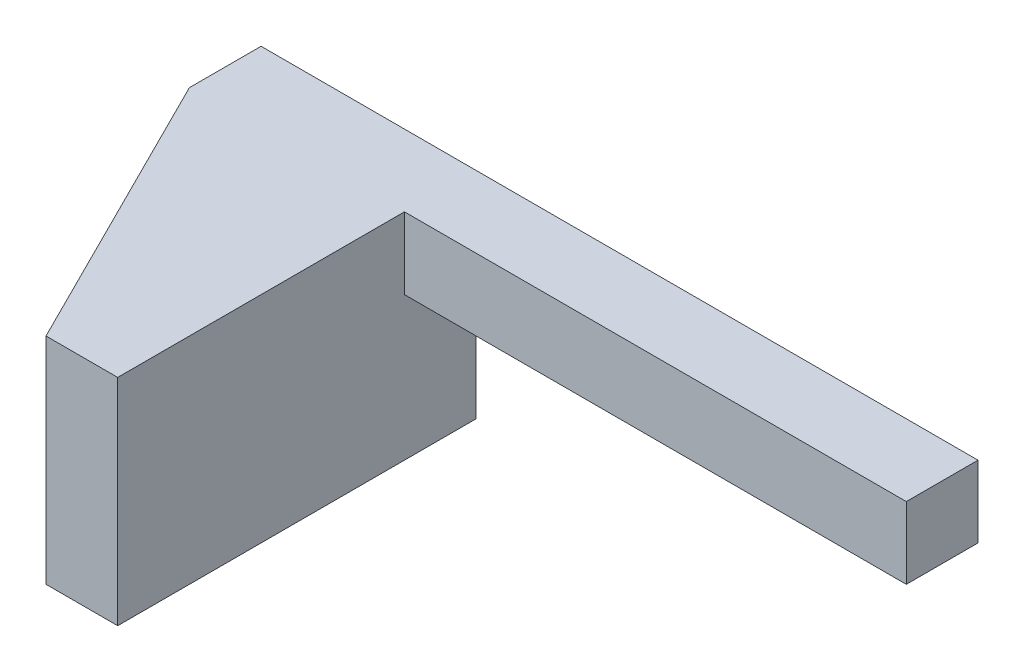
ISO-10303-21;
HEADER;
FILE_DESCRIPTION(('STEP AP214'),'2;1');
FILE_NAME('part.step','',(''),(''),'','','');
FILE_SCHEMA(('AUTOMOTIVE_DESIGN { 1 0 10303 214 1 1 1 1 }'));
ENDSEC;
DATA;
#1=APPLICATION_CONTEXT('core data for automotive mechanical design processes');
#2=APPLICATION_PROTOCOL_DEFINITION('international standard','automotive_design',2000,#1);
#3=PRODUCT_CONTEXT('',#1,'mechanical');
#4=PRODUCT('Part','Part','',(#3));
#5=PRODUCT_RELATED_PRODUCT_CATEGORY('part','',(#4));
#6=PRODUCT_DEFINITION_FORMATION('','',#4);
#7=PRODUCT_DEFINITION_CONTEXT('part definition',#1,'design');
#8=PRODUCT_DEFINITION('design','',#6,#7);
#9=PRODUCT_DEFINITION_SHAPE('','',#8);
#10=(LENGTH_UNIT() NAMED_UNIT(*) SI_UNIT(.MILLI.,.METRE.));
#11=(NAMED_UNIT(*) PLANE_ANGLE_UNIT() SI_UNIT($,.RADIAN.));
#12=(NAMED_UNIT(*) SI_UNIT($,.STERADIAN.) SOLID_ANGLE_UNIT());
#13=UNCERTAINTY_MEASURE_WITH_UNIT(LENGTH_MEASURE(1.E-05),#10,'distance_accuracy_value','');
#14=(GEOMETRIC_REPRESENTATION_CONTEXT(3) GLOBAL_UNCERTAINTY_ASSIGNED_CONTEXT((#13)) GLOBAL_UNIT_ASSIGNED_CONTEXT((#10,
#11,#12)) REPRESENTATION_CONTEXT('',''));
#15=CARTESIAN_POINT('',(0.,0.,0.));
#16=DIRECTION('',(0.,0.,1.));
#17=DIRECTION('',(1.,0.,0.));
#18=AXIS2_PLACEMENT_3D('',#15,#16,#17);
#19=CARTESIAN_POINT('',(0.,15.,5.));
#20=DIRECTION('',(-1.,0.,0.));
#21=DIRECTION('',(0.,0.,1.));
#22=AXIS2_PLACEMENT_3D('',#19,#20,#21);
#23=PLANE('',#22);
#24=DIRECTION('',(0.,-1.,0.));
#25=VECTOR('',#24,1.);
#26=CARTESIAN_POINT('',(0.,15.,5.));
#27=LINE('',#26,#25);
#28=CARTESIAN_POINT('',(0.,15.,5.));
#29=VERTEX_POINT('',#28);
#30=CARTESIAN_POINT('',(0.,10.,5.));
#31=VERTEX_POINT('',#30);
#32=EDGE_CURVE('E121',#29,#31,#27,.T.);
#33=ORIENTED_EDGE('',*,*,#32,.T.);
#34=DIRECTION('',(0.,0.,1.));
#35=VECTOR('',#34,1.);
#36=CARTESIAN_POINT('',(0.,10.,0.));
#37=LINE('',#36,#35);
#38=CARTESIAN_POINT('',(0.,10.,0.));
#39=VERTEX_POINT('',#38);
#40=EDGE_CURVE('E156',#39,#31,#37,.T.);
#41=ORIENTED_EDGE('',*,*,#40,.F.);
#42=DIRECTION('',(0.,-1.,0.));
#43=VECTOR('',#42,1.);
#44=CARTESIAN_POINT('',(0.,15.,0.));
#45=LINE('',#44,#43);
#46=CARTESIAN_POINT('',(0.,15.,0.));
#47=VERTEX_POINT('',#46);
#48=EDGE_CURVE('E47',#47,#39,#45,.T.);
#49=ORIENTED_EDGE('',*,*,#48,.F.);
#50=DIRECTION('',(0.,0.,-1.));
#51=VECTOR('',#50,1.);
#52=CARTESIAN_POINT('',(0.,15.,5.));
#53=LINE('',#52,#51);
#54=EDGE_CURVE('E134',#29,#47,#53,.T.);
#55=ORIENTED_EDGE('',*,*,#54,.F.);
#56=EDGE_LOOP('',(#33,#41,#49,#55));
#57=FACE_BOUND('',#56,.T.);
#58=ADVANCED_FACE('F39',(#57),#23,.F.);
#59=CARTESIAN_POINT('',(0.,15.,0.));
#60=DIRECTION('',(0.,0.,1.));
#61=DIRECTION('',(1.,0.,0.));
#62=AXIS2_PLACEMENT_3D('',#59,#60,#61);
#63=PLANE('',#62);
#64=DIRECTION('',(-1.,0.,0.));
#65=VECTOR('',#64,1.);
#66=CARTESIAN_POINT('',(0.,10.,0.));
#67=LINE('',#66,#65);
#68=CARTESIAN_POINT('',(-35.,9.99999999999999,0.));
#69=VERTEX_POINT('',#68);
#70=EDGE_CURVE('E150',#39,#69,#67,.T.);
#71=ORIENTED_EDGE('',*,*,#70,.T.);
#72=DIRECTION('',(0.,-1.,0.));
#73=VECTOR('',#72,1.);
#74=CARTESIAN_POINT('',(-35.,0.,0.));
#75=LINE('',#74,#73);
#76=CARTESIAN_POINT('',(-35.,0.,0.));
#77=VERTEX_POINT('',#76);
#78=EDGE_CURVE('E159',#69,#77,#75,.T.);
#79=ORIENTED_EDGE('',*,*,#78,.T.);
#80=DIRECTION('',(-1.,0.,0.));
#81=VECTOR('',#80,1.);
#82=CARTESIAN_POINT('',(0.,0.,0.));
#83=LINE('',#82,#81);
#84=CARTESIAN_POINT('',(-50.,0.,0.));
#85=VERTEX_POINT('',#84);
#86=EDGE_CURVE('E125',#77,#85,#83,.T.);
#87=ORIENTED_EDGE('',*,*,#86,.T.);
#88=DIRECTION('',(0.,-1.,0.));
#89=VECTOR('',#88,1.);
#90=CARTESIAN_POINT('',(-50.,15.,0.));
#91=LINE('',#90,#89);
#92=CARTESIAN_POINT('',(-50.,15.,0.));
#93=VERTEX_POINT('',#92);
#94=EDGE_CURVE('E141',#93,#85,#91,.T.);
#95=ORIENTED_EDGE('',*,*,#94,.F.);
#96=DIRECTION('',(-1.,0.,0.));
#97=VECTOR('',#96,1.);
#98=CARTESIAN_POINT('',(0.,15.,0.));
#99=LINE('',#98,#97);
#100=EDGE_CURVE('E90',#47,#93,#99,.T.);
#101=ORIENTED_EDGE('',*,*,#100,.F.);
#102=ORIENTED_EDGE('',*,*,#48,.T.);
#103=EDGE_LOOP('',(#71,#79,#87,#95,#101,#102));
#104=FACE_BOUND('',#103,.T.);
#105=ADVANCED_FACE('F146',(#104),#63,.F.);
#106=CARTESIAN_POINT('',(-50.,15.,0.));
#107=DIRECTION('',(1.,0.,0.));
#108=DIRECTION('',(0.,0.,-1.));
#109=AXIS2_PLACEMENT_3D('',#106,#107,#108);
#110=PLANE('',#109);
#111=DIRECTION('',(0.,0.,1.));
#112=VECTOR('',#111,1.);
#113=CARTESIAN_POINT('',(-50.,0.,0.));
#114=LINE('',#113,#112);
#115=CARTESIAN_POINT('',(-50.,0.,5.00000000000001));
#116=VERTEX_POINT('',#115);
#117=EDGE_CURVE('E127',#85,#116,#114,.T.);
#118=ORIENTED_EDGE('',*,*,#117,.T.);
#119=DIRECTION('',(0.,-1.,0.));
#120=VECTOR('',#119,1.);
#121=CARTESIAN_POINT('',(-50.,15.,5.00000000000001));
#122=LINE('',#121,#120);
#123=CARTESIAN_POINT('',(-50.,15.,5.00000000000001));
#124=VERTEX_POINT('',#123);
#125=EDGE_CURVE('E139',#124,#116,#122,.T.);
#126=ORIENTED_EDGE('',*,*,#125,.F.);
#127=DIRECTION('',(0.,0.,1.));
#128=VECTOR('',#127,1.);
#129=CARTESIAN_POINT('',(-50.,15.,0.));
#130=LINE('',#129,#128);
#131=EDGE_CURVE('E166',#93,#124,#130,.T.);
#132=ORIENTED_EDGE('',*,*,#131,.F.);
#133=ORIENTED_EDGE('',*,*,#94,.T.);
#134=EDGE_LOOP('',(#118,#126,#132,#133));
#135=FACE_BOUND('',#134,.T.);
#136=ADVANCED_FACE('F170',(#135),#110,.F.);
#137=CARTESIAN_POINT('',(-50.,15.,5.00000000000001));
#138=DIRECTION('',(0.894427190999916,0.,-0.447213595499958));
#139=DIRECTION('',(-0.447213595499958,0.,-0.894427190999916));
#140=AXIS2_PLACEMENT_3D('',#137,#138,#139);
#141=PLANE('',#140);
#142=DIRECTION('',(0.447213595499958,0.,0.894427190999916));
#143=VECTOR('',#142,1.);
#144=CARTESIAN_POINT('',(-50.,0.,5.00000000000001));
#145=LINE('',#144,#143);
#146=CARTESIAN_POINT('',(-40.,0.,25.));
#147=VERTEX_POINT('',#146);
#148=EDGE_CURVE('E73',#116,#147,#145,.T.);
#149=ORIENTED_EDGE('',*,*,#148,.T.);
#150=DIRECTION('',(0.,-1.,0.));
#151=VECTOR('',#150,1.);
#152=CARTESIAN_POINT('',(-40.,15.,25.));
#153=LINE('',#152,#151);
#154=CARTESIAN_POINT('',(-40.,15.,25.));
#155=VERTEX_POINT('',#154);
#156=EDGE_CURVE('E114',#155,#147,#153,.T.);
#157=ORIENTED_EDGE('',*,*,#156,.F.);
#158=DIRECTION('',(0.447213595499958,0.,0.894427190999916));
#159=VECTOR('',#158,1.);
#160=CARTESIAN_POINT('',(-50.,15.,5.00000000000001));
#161=LINE('',#160,#159);
#162=EDGE_CURVE('E107',#124,#155,#161,.T.);
#163=ORIENTED_EDGE('',*,*,#162,.F.);
#164=ORIENTED_EDGE('',*,*,#125,.T.);
#165=EDGE_LOOP('',(#149,#157,#163,#164));
#166=FACE_BOUND('',#165,.T.);
#167=ADVANCED_FACE('F172',(#166),#141,.F.);
#168=CARTESIAN_POINT('',(-40.,15.,25.));
#169=DIRECTION('',(0.,0.,-1.));
#170=DIRECTION('',(-1.,0.,0.));
#171=AXIS2_PLACEMENT_3D('',#168,#169,#170);
#172=PLANE('',#171);
#173=DIRECTION('',(1.,0.,0.));
#174=VECTOR('',#173,1.);
#175=CARTESIAN_POINT('',(-40.,0.,25.));
#176=LINE('',#175,#174);
#177=CARTESIAN_POINT('',(-35.,0.,25.));
#178=VERTEX_POINT('',#177);
#179=EDGE_CURVE('E112',#147,#178,#176,.T.);
#180=ORIENTED_EDGE('',*,*,#179,.T.);
#181=DIRECTION('',(0.,-1.,0.));
#182=VECTOR('',#181,1.);
#183=CARTESIAN_POINT('',(-35.,15.,25.));
#184=LINE('',#183,#182);
#185=CARTESIAN_POINT('',(-35.,15.,25.));
#186=VERTEX_POINT('',#185);
#187=EDGE_CURVE('E81',#186,#178,#184,.T.);
#188=ORIENTED_EDGE('',*,*,#187,.F.);
#189=DIRECTION('',(1.,0.,0.));
#190=VECTOR('',#189,1.);
#191=CARTESIAN_POINT('',(-40.,15.,25.));
#192=LINE('',#191,#190);
#193=EDGE_CURVE('E102',#155,#186,#192,.T.);
#194=ORIENTED_EDGE('',*,*,#193,.F.);
#195=ORIENTED_EDGE('',*,*,#156,.T.);
#196=EDGE_LOOP('',(#180,#188,#194,#195));
#197=FACE_BOUND('',#196,.T.);
#198=ADVANCED_FACE('F110',(#197),#172,.F.);
#199=CARTESIAN_POINT('',(-35.,15.,25.));
#200=DIRECTION('',(-1.,0.,0.));
#201=DIRECTION('',(0.,0.,1.));
#202=AXIS2_PLACEMENT_3D('',#199,#200,#201);
#203=PLANE('',#202);
#204=ORIENTED_EDGE('',*,*,#187,.T.);
#205=DIRECTION('',(0.,0.,-1.));
#206=VECTOR('',#205,1.);
#207=CARTESIAN_POINT('',(-35.,0.,25.));
#208=LINE('',#207,#206);
#209=EDGE_CURVE('E132',#178,#77,#208,.T.);
#210=ORIENTED_EDGE('',*,*,#209,.T.);
#211=ORIENTED_EDGE('',*,*,#78,.F.);
#212=DIRECTION('',(0.,0.,1.));
#213=VECTOR('',#212,1.);
#214=CARTESIAN_POINT('',(-35.,9.99999999999999,0.));
#215=LINE('',#214,#213);
#216=CARTESIAN_POINT('',(-35.,9.99999999999999,5.));
#217=VERTEX_POINT('',#216);
#218=EDGE_CURVE('E128',#69,#217,#215,.T.);
#219=ORIENTED_EDGE('',*,*,#218,.T.);
#220=DIRECTION('',(0.,-1.,0.));
#221=VECTOR('',#220,1.);
#222=CARTESIAN_POINT('',(-35.,15.,5.));
#223=LINE('',#222,#221);
#224=CARTESIAN_POINT('',(-35.,15.,5.));
#225=VERTEX_POINT('',#224);
#226=EDGE_CURVE('E115',#225,#217,#223,.T.);
#227=ORIENTED_EDGE('',*,*,#226,.F.);
#228=DIRECTION('',(0.,0.,-1.));
#229=VECTOR('',#228,1.);
#230=CARTESIAN_POINT('',(-35.,15.,25.));
#231=LINE('',#230,#229);
#232=EDGE_CURVE('E104',#186,#225,#231,.T.);
#233=ORIENTED_EDGE('',*,*,#232,.F.);
#234=EDGE_LOOP('',(#204,#210,#211,#219,#227,#233));
#235=FACE_BOUND('',#234,.T.);
#236=ADVANCED_FACE('F117',(#235),#203,.F.);
#237=CARTESIAN_POINT('',(-35.,15.,5.));
#238=DIRECTION('',(0.,0.,-1.));
#239=DIRECTION('',(-1.,0.,0.));
#240=AXIS2_PLACEMENT_3D('',#237,#238,#239);
#241=PLANE('',#240);
#242=ORIENTED_EDGE('',*,*,#226,.T.);
#243=DIRECTION('',(1.,0.,0.));
#244=VECTOR('',#243,1.);
#245=CARTESIAN_POINT('',(-35.,9.99999999999999,5.));
#246=LINE('',#245,#244);
#247=EDGE_CURVE('E11',#217,#31,#246,.T.);
#248=ORIENTED_EDGE('',*,*,#247,.T.);
#249=ORIENTED_EDGE('',*,*,#32,.F.);
#250=DIRECTION('',(1.,0.,0.));
#251=VECTOR('',#250,1.);
#252=CARTESIAN_POINT('',(-35.,15.,5.));
#253=LINE('',#252,#251);
#254=EDGE_CURVE('E55',#225,#29,#253,.T.);
#255=ORIENTED_EDGE('',*,*,#254,.F.);
#256=EDGE_LOOP('',(#242,#248,#249,#255));
#257=FACE_BOUND('',#256,.T.);
#258=ADVANCED_FACE('F184',(#257),#241,.F.);
#259=CARTESIAN_POINT('',(0.,15.,0.));
#260=DIRECTION('',(0.,1.,0.));
#261=DIRECTION('',(0.,0.,1.));
#262=AXIS2_PLACEMENT_3D('',#259,#260,#261);
#263=PLANE('',#262);
#264=ORIENTED_EDGE('',*,*,#54,.T.);
#265=ORIENTED_EDGE('',*,*,#100,.T.);
#266=ORIENTED_EDGE('',*,*,#131,.T.);
#267=ORIENTED_EDGE('',*,*,#162,.T.);
#268=ORIENTED_EDGE('',*,*,#193,.T.);
#269=ORIENTED_EDGE('',*,*,#232,.T.);
#270=ORIENTED_EDGE('',*,*,#254,.T.);
#271=EDGE_LOOP('',(#264,#265,#266,#267,#268,#269,#270));
#272=FACE_BOUND('',#271,.T.);
#273=ADVANCED_FACE('F103',(#272),#263,.T.);
#274=CARTESIAN_POINT('',(0.,0.,0.));
#275=DIRECTION('',(0.,1.,0.));
#276=DIRECTION('',(0.,0.,1.));
#277=AXIS2_PLACEMENT_3D('',#274,#275,#276);
#278=PLANE('',#277);
#279=ORIENTED_EDGE('',*,*,#86,.F.);
#280=ORIENTED_EDGE('',*,*,#209,.F.);
#281=ORIENTED_EDGE('',*,*,#179,.F.);
#282=ORIENTED_EDGE('',*,*,#148,.F.);
#283=ORIENTED_EDGE('',*,*,#117,.F.);
#284=EDGE_LOOP('',(#279,#280,#281,#282,#283));
#285=FACE_BOUND('',#284,.T.);
#286=ADVANCED_FACE('F175',(#285),#278,.F.);
#287=CARTESIAN_POINT('',(0.,10.,0.));
#288=DIRECTION('',(0.,1.,0.));
#289=DIRECTION('',(-1.,0.,0.));
#290=AXIS2_PLACEMENT_3D('',#287,#288,#289);
#291=PLANE('',#290);
#292=ORIENTED_EDGE('',*,*,#218,.F.);
#293=ORIENTED_EDGE('',*,*,#70,.F.);
#294=ORIENTED_EDGE('',*,*,#40,.T.);
#295=ORIENTED_EDGE('',*,*,#247,.F.);
#296=EDGE_LOOP('',(#292,#293,#294,#295));
#297=FACE_BOUND('',#296,.T.);
#298=ADVANCED_FACE('F182',(#297),#291,.F.);
#299=CLOSED_SHELL('',(#58,#105,#136,#167,#198,#236,#258,#273,#286,#298));
#300=MANIFOLD_SOLID_BREP('B2',#299);
#301=ADVANCED_BREP_SHAPE_REPRESENTATION('',(#18,#300),#14);
#302=SHAPE_DEFINITION_REPRESENTATION(#9,#301);
ENDSEC;
END-ISO-10303-21;
